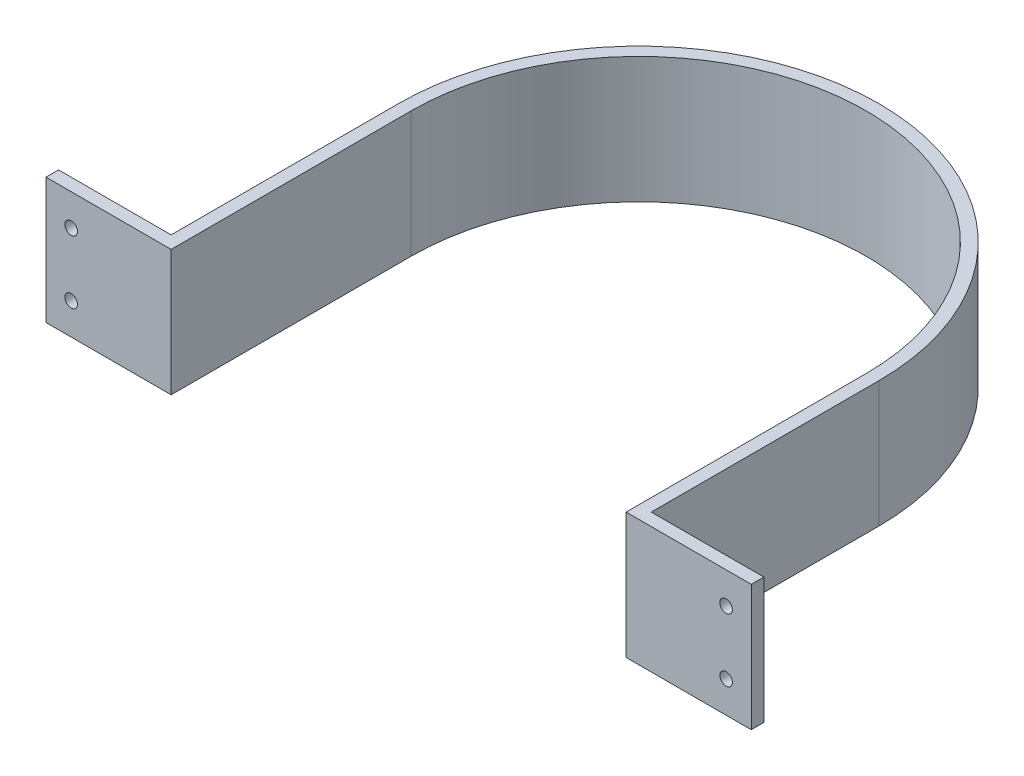
ISO-10303-21;
HEADER;
FILE_DESCRIPTION(('STEP AP214'),'2;1');
FILE_NAME('part.step','',(''),(''),'','','');
FILE_SCHEMA(('AUTOMOTIVE_DESIGN { 1 0 10303 214 1 1 1 1 }'));
ENDSEC;
DATA;
#1=APPLICATION_CONTEXT('core data for automotive mechanical design processes');
#2=APPLICATION_PROTOCOL_DEFINITION('international standard','automotive_design',2000,#1);
#3=PRODUCT_CONTEXT('',#1,'mechanical');
#4=PRODUCT('Part','Part','',(#3));
#5=PRODUCT_RELATED_PRODUCT_CATEGORY('part','',(#4));
#6=PRODUCT_DEFINITION_FORMATION('','',#4);
#7=PRODUCT_DEFINITION_CONTEXT('part definition',#1,'design');
#8=PRODUCT_DEFINITION('design','',#6,#7);
#9=PRODUCT_DEFINITION_SHAPE('','',#8);
#10=(LENGTH_UNIT() NAMED_UNIT(*) SI_UNIT(.MILLI.,.METRE.));
#11=(NAMED_UNIT(*) PLANE_ANGLE_UNIT() SI_UNIT($,.RADIAN.));
#12=(NAMED_UNIT(*) SI_UNIT($,.STERADIAN.) SOLID_ANGLE_UNIT());
#13=UNCERTAINTY_MEASURE_WITH_UNIT(LENGTH_MEASURE(1.E-05),#10,'distance_accuracy_value','');
#14=(GEOMETRIC_REPRESENTATION_CONTEXT(3) GLOBAL_UNCERTAINTY_ASSIGNED_CONTEXT((#13)) GLOBAL_UNIT_ASSIGNED_CONTEXT((#10,
#11,#12)) REPRESENTATION_CONTEXT('',''));
#15=CARTESIAN_POINT('',(0.,0.,0.));
#16=DIRECTION('',(0.,0.,1.));
#17=DIRECTION('',(1.,0.,0.));
#18=AXIS2_PLACEMENT_3D('',#15,#16,#17);
#19=CARTESIAN_POINT('',(0.,31.75,114.7));
#20=DIRECTION('',(0.,0.,1.));
#21=DIRECTION('',(1.,0.,0.));
#22=AXIS2_PLACEMENT_3D('',#19,#20,#21);
#23=PLANE('',#22);
#24=CARTESIAN_POINT('',(-165.1,-15.875,114.7));
#25=DIRECTION('',(0.,0.,1.));
#26=DIRECTION('',(1.,0.,0.));
#27=AXIS2_PLACEMENT_3D('',#24,#25,#26);
#28=CIRCLE('',#27,3.175);
#29=CARTESIAN_POINT('',(-161.925,-15.875,114.7));
#30=VERTEX_POINT('',#29);
#31=EDGE_CURVE('E304',#30,#30,#28,.F.);
#32=ORIENTED_EDGE('',*,*,#31,.F.);
#33=EDGE_LOOP('',(#32));
#34=FACE_BOUND('',#33,.T.);
#35=CARTESIAN_POINT('',(-165.1,15.875,114.7));
#36=DIRECTION('',(0.,0.,1.));
#37=DIRECTION('',(1.,0.,0.));
#38=AXIS2_PLACEMENT_3D('',#35,#36,#37);
#39=CIRCLE('',#38,3.175);
#40=CARTESIAN_POINT('',(-161.925,15.875,114.7));
#41=VERTEX_POINT('',#40);
#42=EDGE_CURVE('E174',#41,#41,#39,.F.);
#43=ORIENTED_EDGE('',*,*,#42,.F.);
#44=EDGE_LOOP('',(#43));
#45=FACE_BOUND('',#44,.T.);
#46=DIRECTION('',(-1.,0.,0.));
#47=VECTOR('',#46,1.);
#48=CARTESIAN_POINT('',(0.,-31.75,114.7));
#49=LINE('',#48,#47);
#50=CARTESIAN_POINT('',(-121.05,-31.75,114.7));
#51=VERTEX_POINT('',#50);
#52=CARTESIAN_POINT('',(-177.8,-31.75,114.7));
#53=VERTEX_POINT('',#52);
#54=EDGE_CURVE('E169',#51,#53,#49,.T.);
#55=ORIENTED_EDGE('',*,*,#54,.T.);
#56=DIRECTION('',(0.,-1.,0.));
#57=VECTOR('',#56,1.);
#58=CARTESIAN_POINT('',(-177.8,31.75,114.7));
#59=LINE('',#58,#57);
#60=CARTESIAN_POINT('',(-177.8,31.75,114.7));
#61=VERTEX_POINT('',#60);
#62=EDGE_CURVE('E11',#61,#53,#59,.T.);
#63=ORIENTED_EDGE('',*,*,#62,.F.);
#64=DIRECTION('',(-1.,0.,0.));
#65=VECTOR('',#64,1.);
#66=CARTESIAN_POINT('',(0.,31.75,114.7));
#67=LINE('',#66,#65);
#68=CARTESIAN_POINT('',(-121.05,31.75,114.7));
#69=VERTEX_POINT('',#68);
#70=EDGE_CURVE('E211',#69,#61,#67,.T.);
#71=ORIENTED_EDGE('',*,*,#70,.F.);
#72=DIRECTION('',(0.,-1.,0.));
#73=VECTOR('',#72,1.);
#74=CARTESIAN_POINT('',(-121.05,31.75,114.7));
#75=LINE('',#74,#73);
#76=EDGE_CURVE('E168',#69,#51,#75,.T.);
#77=ORIENTED_EDGE('',*,*,#76,.T.);
#78=EDGE_LOOP('',(#55,#63,#71,#77));
#79=FACE_BOUND('',#78,.T.);
#80=ADVANCED_FACE('F41',(#34,#45,#79),#23,.F.);
#81=CARTESIAN_POINT('',(-177.8,31.75,0.));
#82=DIRECTION('',(1.,0.,0.));
#83=DIRECTION('',(0.,0.,-1.));
#84=AXIS2_PLACEMENT_3D('',#81,#82,#83);
#85=PLANE('',#84);
#86=DIRECTION('',(0.,0.,1.));
#87=VECTOR('',#86,1.);
#88=CARTESIAN_POINT('',(-177.8,-31.75,0.));
#89=LINE('',#88,#87);
#90=CARTESIAN_POINT('',(-177.8,-31.75,121.05));
#91=VERTEX_POINT('',#90);
#92=EDGE_CURVE('E173',#53,#91,#89,.T.);
#93=ORIENTED_EDGE('',*,*,#92,.T.);
#94=DIRECTION('',(0.,-1.,0.));
#95=VECTOR('',#94,1.);
#96=CARTESIAN_POINT('',(-177.8,31.75,121.05));
#97=LINE('',#96,#95);
#98=CARTESIAN_POINT('',(-177.8,31.75,121.05));
#99=VERTEX_POINT('',#98);
#100=EDGE_CURVE('E50',#99,#91,#97,.T.);
#101=ORIENTED_EDGE('',*,*,#100,.F.);
#102=DIRECTION('',(0.,0.,1.));
#103=VECTOR('',#102,1.);
#104=CARTESIAN_POINT('',(-177.8,31.75,0.));
#105=LINE('',#104,#103);
#106=EDGE_CURVE('E112',#61,#99,#105,.T.);
#107=ORIENTED_EDGE('',*,*,#106,.F.);
#108=ORIENTED_EDGE('',*,*,#62,.T.);
#109=EDGE_LOOP('',(#93,#101,#107,#108));
#110=FACE_BOUND('',#109,.T.);
#111=ADVANCED_FACE('F243',(#110),#85,.F.);
#112=CARTESIAN_POINT('',(0.,31.75,121.05));
#113=DIRECTION('',(0.,0.,1.));
#114=DIRECTION('',(1.,0.,0.));
#115=AXIS2_PLACEMENT_3D('',#112,#113,#114);
#116=PLANE('',#115);
#117=CARTESIAN_POINT('',(-165.1,-15.875,121.05));
#118=DIRECTION('',(0.,0.,1.));
#119=DIRECTION('',(-1.,0.,0.));
#120=AXIS2_PLACEMENT_3D('',#117,#118,#119);
#121=CIRCLE('',#120,3.175);
#122=CARTESIAN_POINT('',(-168.275,-15.875,121.05));
#123=VERTEX_POINT('',#122);
#124=EDGE_CURVE('E320',#123,#123,#121,.T.);
#125=ORIENTED_EDGE('',*,*,#124,.F.);
#126=EDGE_LOOP('',(#125));
#127=FACE_BOUND('',#126,.T.);
#128=CARTESIAN_POINT('',(-165.1,15.875,121.05));
#129=DIRECTION('',(0.,0.,1.));
#130=DIRECTION('',(1.,0.,0.));
#131=AXIS2_PLACEMENT_3D('',#128,#129,#130);
#132=CIRCLE('',#131,3.175);
#133=CARTESIAN_POINT('',(-161.925,15.875,121.05));
#134=VERTEX_POINT('',#133);
#135=EDGE_CURVE('E309',#134,#134,#132,.T.);
#136=ORIENTED_EDGE('',*,*,#135,.F.);
#137=EDGE_LOOP('',(#136));
#138=FACE_BOUND('',#137,.T.);
#139=DIRECTION('',(-1.,0.,0.));
#140=VECTOR('',#139,1.);
#141=CARTESIAN_POINT('',(0.,-31.75,121.05));
#142=LINE('',#141,#140);
#143=CARTESIAN_POINT('',(-114.7,-31.75,121.05));
#144=VERTEX_POINT('',#143);
#145=EDGE_CURVE('E178',#144,#91,#142,.T.);
#146=ORIENTED_EDGE('',*,*,#145,.F.);
#147=DIRECTION('',(0.,-1.,0.));
#148=VECTOR('',#147,1.);
#149=CARTESIAN_POINT('',(-114.7,31.75,121.05));
#150=LINE('',#149,#148);
#151=CARTESIAN_POINT('',(-114.7,31.75,121.05));
#152=VERTEX_POINT('',#151);
#153=EDGE_CURVE('E234',#152,#144,#150,.T.);
#154=ORIENTED_EDGE('',*,*,#153,.F.);
#155=DIRECTION('',(-1.,0.,0.));
#156=VECTOR('',#155,1.);
#157=CARTESIAN_POINT('',(0.,31.75,121.05));
#158=LINE('',#157,#156);
#159=EDGE_CURVE('E242',#152,#99,#158,.T.);
#160=ORIENTED_EDGE('',*,*,#159,.T.);
#161=ORIENTED_EDGE('',*,*,#100,.T.);
#162=EDGE_LOOP('',(#146,#154,#160,#161));
#163=FACE_BOUND('',#162,.T.);
#164=ADVANCED_FACE('F240',(#127,#138,#163),#116,.T.);
#165=CARTESIAN_POINT('',(-114.7,31.75,0.));
#166=DIRECTION('',(1.,0.,0.));
#167=DIRECTION('',(0.,0.,-1.));
#168=AXIS2_PLACEMENT_3D('',#165,#166,#167);
#169=PLANE('',#168);
#170=DIRECTION('',(0.,0.,1.));
#171=VECTOR('',#170,1.);
#172=CARTESIAN_POINT('',(-114.7,-31.75,0.));
#173=LINE('',#172,#171);
#174=CARTESIAN_POINT('',(-114.7,-31.75,0.));
#175=VERTEX_POINT('',#174);
#176=EDGE_CURVE('E182',#175,#144,#173,.T.);
#177=ORIENTED_EDGE('',*,*,#176,.F.);
#178=DIRECTION('',(0.,-1.,0.));
#179=VECTOR('',#178,1.);
#180=CARTESIAN_POINT('',(-114.7,31.75,0.));
#181=LINE('',#180,#179);
#182=CARTESIAN_POINT('',(-114.7,31.75,0.));
#183=VERTEX_POINT('',#182);
#184=EDGE_CURVE('E231',#183,#175,#181,.T.);
#185=ORIENTED_EDGE('',*,*,#184,.F.);
#186=DIRECTION('',(0.,0.,1.));
#187=VECTOR('',#186,1.);
#188=CARTESIAN_POINT('',(-114.7,31.75,0.));
#189=LINE('',#188,#187);
#190=EDGE_CURVE('E255',#183,#152,#189,.T.);
#191=ORIENTED_EDGE('',*,*,#190,.T.);
#192=ORIENTED_EDGE('',*,*,#153,.T.);
#193=EDGE_LOOP('',(#177,#185,#191,#192));
#194=FACE_BOUND('',#193,.T.);
#195=ADVANCED_FACE('F252',(#194),#169,.T.);
#196=CARTESIAN_POINT('',(0.,31.75,0.));
#197=DIRECTION('',(0.,-1.,0.));
#198=DIRECTION('',(0.,0.,-1.));
#199=AXIS2_PLACEMENT_3D('',#196,#197,#198);
#200=CYLINDRICAL_SURFACE('',#199,114.7);
#201=CARTESIAN_POINT('',(0.,-31.75,0.));
#202=DIRECTION('',(0.,1.,0.));
#203=DIRECTION('',(0.,0.,1.));
#204=AXIS2_PLACEMENT_3D('',#201,#202,#203);
#205=CIRCLE('',#204,114.7);
#206=CARTESIAN_POINT('',(114.7,-31.75,0.));
#207=VERTEX_POINT('',#206);
#208=EDGE_CURVE('E186',#207,#175,#205,.T.);
#209=ORIENTED_EDGE('',*,*,#208,.F.);
#210=DIRECTION('',(0.,-1.,0.));
#211=VECTOR('',#210,1.);
#212=CARTESIAN_POINT('',(114.7,31.75,0.));
#213=LINE('',#212,#211);
#214=CARTESIAN_POINT('',(114.7,31.75,0.));
#215=VERTEX_POINT('',#214);
#216=EDGE_CURVE('E228',#215,#207,#213,.T.);
#217=ORIENTED_EDGE('',*,*,#216,.F.);
#218=CARTESIAN_POINT('',(0.,31.75,0.));
#219=DIRECTION('',(0.,1.,0.));
#220=DIRECTION('',(0.,0.,1.));
#221=AXIS2_PLACEMENT_3D('',#218,#219,#220);
#222=CIRCLE('',#221,114.7);
#223=EDGE_CURVE('E262',#215,#183,#222,.T.);
#224=ORIENTED_EDGE('',*,*,#223,.T.);
#225=ORIENTED_EDGE('',*,*,#184,.T.);
#226=EDGE_LOOP('',(#209,#217,#224,#225));
#227=FACE_BOUND('',#226,.T.);
#228=ADVANCED_FACE('F351',(#227),#200,.F.);
#229=CARTESIAN_POINT('',(114.7,31.75,0.));
#230=DIRECTION('',(1.,0.,0.));
#231=DIRECTION('',(0.,0.,-1.));
#232=AXIS2_PLACEMENT_3D('',#229,#230,#231);
#233=PLANE('',#232);
#234=DIRECTION('',(0.,0.,1.));
#235=VECTOR('',#234,1.);
#236=CARTESIAN_POINT('',(114.7,-31.75,0.));
#237=LINE('',#236,#235);
#238=CARTESIAN_POINT('',(114.7,-31.75,121.05));
#239=VERTEX_POINT('',#238);
#240=EDGE_CURVE('E190',#207,#239,#237,.T.);
#241=ORIENTED_EDGE('',*,*,#240,.T.);
#242=DIRECTION('',(0.,-1.,0.));
#243=VECTOR('',#242,1.);
#244=CARTESIAN_POINT('',(114.7,31.75,121.05));
#245=LINE('',#244,#243);
#246=CARTESIAN_POINT('',(114.7,31.75,121.05));
#247=VERTEX_POINT('',#246);
#248=EDGE_CURVE('E224',#247,#239,#245,.T.);
#249=ORIENTED_EDGE('',*,*,#248,.F.);
#250=DIRECTION('',(0.,0.,1.));
#251=VECTOR('',#250,1.);
#252=CARTESIAN_POINT('',(114.7,31.75,0.));
#253=LINE('',#252,#251);
#254=EDGE_CURVE('E269',#215,#247,#253,.T.);
#255=ORIENTED_EDGE('',*,*,#254,.F.);
#256=ORIENTED_EDGE('',*,*,#216,.T.);
#257=EDGE_LOOP('',(#241,#249,#255,#256));
#258=FACE_BOUND('',#257,.T.);
#259=ADVANCED_FACE('F344',(#258),#233,.F.);
#260=CARTESIAN_POINT('',(0.,31.75,121.05));
#261=DIRECTION('',(0.,0.,-1.));
#262=DIRECTION('',(-1.,0.,0.));
#263=AXIS2_PLACEMENT_3D('',#260,#261,#262);
#264=PLANE('',#263);
#265=CARTESIAN_POINT('',(165.1,15.8750000000001,121.05));
#266=DIRECTION('',(0.,0.,1.));
#267=DIRECTION('',(-1.,0.,0.));
#268=AXIS2_PLACEMENT_3D('',#265,#266,#267);
#269=CIRCLE('',#268,3.175);
#270=CARTESIAN_POINT('',(161.925,15.8750000000001,121.05));
#271=VERTEX_POINT('',#270);
#272=EDGE_CURVE('E319',#271,#271,#269,.T.);
#273=ORIENTED_EDGE('',*,*,#272,.F.);
#274=EDGE_LOOP('',(#273));
#275=FACE_BOUND('',#274,.T.);
#276=CARTESIAN_POINT('',(165.1,-15.8749999999999,121.05));
#277=DIRECTION('',(0.,0.,1.));
#278=DIRECTION('',(1.,0.,0.));
#279=AXIS2_PLACEMENT_3D('',#276,#277,#278);
#280=CIRCLE('',#279,3.175);
#281=CARTESIAN_POINT('',(168.275,-15.8749999999999,121.05));
#282=VERTEX_POINT('',#281);
#283=EDGE_CURVE('E328',#282,#282,#280,.T.);
#284=ORIENTED_EDGE('',*,*,#283,.F.);
#285=EDGE_LOOP('',(#284));
#286=FACE_BOUND('',#285,.T.);
#287=DIRECTION('',(1.,0.,0.));
#288=VECTOR('',#287,1.);
#289=CARTESIAN_POINT('',(0.,-31.75,121.05));
#290=LINE('',#289,#288);
#291=CARTESIAN_POINT('',(177.8,-31.75,121.05));
#292=VERTEX_POINT('',#291);
#293=EDGE_CURVE('E193',#239,#292,#290,.T.);
#294=ORIENTED_EDGE('',*,*,#293,.T.);
#295=DIRECTION('',(0.,-1.,0.));
#296=VECTOR('',#295,1.);
#297=CARTESIAN_POINT('',(177.8,31.75,121.05));
#298=LINE('',#297,#296);
#299=CARTESIAN_POINT('',(177.8,31.75,121.05));
#300=VERTEX_POINT('',#299);
#301=EDGE_CURVE('E221',#300,#292,#298,.T.);
#302=ORIENTED_EDGE('',*,*,#301,.F.);
#303=DIRECTION('',(1.,0.,0.));
#304=VECTOR('',#303,1.);
#305=CARTESIAN_POINT('',(0.,31.75,121.05));
#306=LINE('',#305,#304);
#307=EDGE_CURVE('E272',#247,#300,#306,.T.);
#308=ORIENTED_EDGE('',*,*,#307,.F.);
#309=ORIENTED_EDGE('',*,*,#248,.T.);
#310=EDGE_LOOP('',(#294,#302,#308,#309));
#311=FACE_BOUND('',#310,.T.);
#312=ADVANCED_FACE('F341',(#275,#286,#311),#264,.F.);
#313=CARTESIAN_POINT('',(177.8,31.75,0.));
#314=DIRECTION('',(1.,0.,0.));
#315=DIRECTION('',(0.,0.,-1.));
#316=AXIS2_PLACEMENT_3D('',#313,#314,#315);
#317=PLANE('',#316);
#318=DIRECTION('',(0.,0.,1.));
#319=VECTOR('',#318,1.);
#320=CARTESIAN_POINT('',(177.8,-31.75,0.));
#321=LINE('',#320,#319);
#322=CARTESIAN_POINT('',(177.8,-31.75,114.7));
#323=VERTEX_POINT('',#322);
#324=EDGE_CURVE('E197',#323,#292,#321,.T.);
#325=ORIENTED_EDGE('',*,*,#324,.F.);
#326=DIRECTION('',(0.,-1.,0.));
#327=VECTOR('',#326,1.);
#328=CARTESIAN_POINT('',(177.8,31.75,114.7));
#329=LINE('',#328,#327);
#330=CARTESIAN_POINT('',(177.8,31.75,114.7));
#331=VERTEX_POINT('',#330);
#332=EDGE_CURVE('E218',#331,#323,#329,.T.);
#333=ORIENTED_EDGE('',*,*,#332,.F.);
#334=DIRECTION('',(0.,0.,1.));
#335=VECTOR('',#334,1.);
#336=CARTESIAN_POINT('',(177.8,31.75,0.));
#337=LINE('',#336,#335);
#338=EDGE_CURVE('E162',#331,#300,#337,.T.);
#339=ORIENTED_EDGE('',*,*,#338,.T.);
#340=ORIENTED_EDGE('',*,*,#301,.T.);
#341=EDGE_LOOP('',(#325,#333,#339,#340));
#342=FACE_BOUND('',#341,.T.);
#343=ADVANCED_FACE('F278',(#342),#317,.T.);
#344=CARTESIAN_POINT('',(0.,31.75,114.7));
#345=DIRECTION('',(0.,0.,-1.));
#346=DIRECTION('',(-1.,0.,0.));
#347=AXIS2_PLACEMENT_3D('',#344,#345,#346);
#348=PLANE('',#347);
#349=CARTESIAN_POINT('',(165.1,15.8750000000001,114.7));
#350=DIRECTION('',(0.,0.,1.));
#351=DIRECTION('',(1.,0.,0.));
#352=AXIS2_PLACEMENT_3D('',#349,#350,#351);
#353=CIRCLE('',#352,3.175);
#354=CARTESIAN_POINT('',(168.275,15.8750000000001,114.7));
#355=VERTEX_POINT('',#354);
#356=EDGE_CURVE('E324',#355,#355,#353,.F.);
#357=ORIENTED_EDGE('',*,*,#356,.F.);
#358=EDGE_LOOP('',(#357));
#359=FACE_BOUND('',#358,.T.);
#360=CARTESIAN_POINT('',(165.1,-15.8749999999999,114.7));
#361=DIRECTION('',(0.,0.,1.));
#362=DIRECTION('',(1.,0.,0.));
#363=AXIS2_PLACEMENT_3D('',#360,#361,#362);
#364=CIRCLE('',#363,3.175);
#365=CARTESIAN_POINT('',(168.275,-15.8749999999999,114.7));
#366=VERTEX_POINT('',#365);
#367=EDGE_CURVE('E313',#366,#366,#364,.F.);
#368=ORIENTED_EDGE('',*,*,#367,.F.);
#369=EDGE_LOOP('',(#368));
#370=FACE_BOUND('',#369,.T.);
#371=DIRECTION('',(1.,0.,0.));
#372=VECTOR('',#371,1.);
#373=CARTESIAN_POINT('',(0.,-31.75,114.7));
#374=LINE('',#373,#372);
#375=CARTESIAN_POINT('',(121.05,-31.75,114.7));
#376=VERTEX_POINT('',#375);
#377=EDGE_CURVE('E201',#376,#323,#374,.T.);
#378=ORIENTED_EDGE('',*,*,#377,.F.);
#379=DIRECTION('',(0.,-1.,0.));
#380=VECTOR('',#379,1.);
#381=CARTESIAN_POINT('',(121.05,31.75,114.7));
#382=LINE('',#381,#380);
#383=CARTESIAN_POINT('',(121.05,31.75,114.7));
#384=VERTEX_POINT('',#383);
#385=EDGE_CURVE('E147',#384,#376,#382,.T.);
#386=ORIENTED_EDGE('',*,*,#385,.F.);
#387=DIRECTION('',(1.,0.,0.));
#388=VECTOR('',#387,1.);
#389=CARTESIAN_POINT('',(0.,31.75,114.7));
#390=LINE('',#389,#388);
#391=EDGE_CURVE('E158',#384,#331,#390,.T.);
#392=ORIENTED_EDGE('',*,*,#391,.T.);
#393=ORIENTED_EDGE('',*,*,#332,.T.);
#394=EDGE_LOOP('',(#378,#386,#392,#393));
#395=FACE_BOUND('',#394,.T.);
#396=ADVANCED_FACE('F283',(#359,#370,#395),#348,.T.);
#397=CARTESIAN_POINT('',(121.05,31.75,0.));
#398=DIRECTION('',(1.,0.,0.));
#399=DIRECTION('',(0.,0.,-1.));
#400=AXIS2_PLACEMENT_3D('',#397,#398,#399);
#401=PLANE('',#400);
#402=DIRECTION('',(0.,0.,1.));
#403=VECTOR('',#402,1.);
#404=CARTESIAN_POINT('',(121.05,-31.75,0.));
#405=LINE('',#404,#403);
#406=CARTESIAN_POINT('',(121.05,-31.75,0.));
#407=VERTEX_POINT('',#406);
#408=EDGE_CURVE('E145',#407,#376,#405,.T.);
#409=ORIENTED_EDGE('',*,*,#408,.F.);
#410=DIRECTION('',(0.,-1.,0.));
#411=VECTOR('',#410,1.);
#412=CARTESIAN_POINT('',(121.05,31.75,0.));
#413=LINE('',#412,#411);
#414=CARTESIAN_POINT('',(121.05,31.75,0.));
#415=VERTEX_POINT('',#414);
#416=EDGE_CURVE('E139',#415,#407,#413,.T.);
#417=ORIENTED_EDGE('',*,*,#416,.F.);
#418=DIRECTION('',(0.,0.,1.));
#419=VECTOR('',#418,1.);
#420=CARTESIAN_POINT('',(121.05,31.75,0.));
#421=LINE('',#420,#419);
#422=EDGE_CURVE('E143',#415,#384,#421,.T.);
#423=ORIENTED_EDGE('',*,*,#422,.T.);
#424=ORIENTED_EDGE('',*,*,#385,.T.);
#425=EDGE_LOOP('',(#409,#417,#423,#424));
#426=FACE_BOUND('',#425,.T.);
#427=ADVANCED_FACE('F141',(#426),#401,.T.);
#428=CARTESIAN_POINT('',(0.,31.75,0.));
#429=DIRECTION('',(0.,-1.,0.));
#430=DIRECTION('',(0.,0.,-1.));
#431=AXIS2_PLACEMENT_3D('',#428,#429,#430);
#432=CYLINDRICAL_SURFACE('',#431,121.05);
#433=CARTESIAN_POINT('',(0.,-31.75,0.));
#434=DIRECTION('',(0.,1.,0.));
#435=DIRECTION('',(0.,0.,1.));
#436=AXIS2_PLACEMENT_3D('',#433,#434,#435);
#437=CIRCLE('',#436,121.05);
#438=CARTESIAN_POINT('',(-121.05,-31.75,0.));
#439=VERTEX_POINT('',#438);
#440=EDGE_CURVE('E98',#407,#439,#437,.T.);
#441=ORIENTED_EDGE('',*,*,#440,.T.);
#442=DIRECTION('',(0.,-1.,0.));
#443=VECTOR('',#442,1.);
#444=CARTESIAN_POINT('',(-121.05,31.75,0.));
#445=LINE('',#444,#443);
#446=CARTESIAN_POINT('',(-121.05,31.75,0.));
#447=VERTEX_POINT('',#446);
#448=EDGE_CURVE('E148',#447,#439,#445,.T.);
#449=ORIENTED_EDGE('',*,*,#448,.F.);
#450=CARTESIAN_POINT('',(0.,31.75,0.));
#451=DIRECTION('',(0.,1.,0.));
#452=DIRECTION('',(0.,0.,1.));
#453=AXIS2_PLACEMENT_3D('',#450,#451,#452);
#454=CIRCLE('',#453,121.05);
#455=EDGE_CURVE('E150',#415,#447,#454,.T.);
#456=ORIENTED_EDGE('',*,*,#455,.F.);
#457=ORIENTED_EDGE('',*,*,#416,.T.);
#458=EDGE_LOOP('',(#441,#449,#456,#457));
#459=FACE_BOUND('',#458,.T.);
#460=ADVANCED_FACE('F151',(#459),#432,.T.);
#461=CARTESIAN_POINT('',(-121.05,31.75,0.));
#462=DIRECTION('',(1.,0.,0.));
#463=DIRECTION('',(0.,0.,-1.));
#464=AXIS2_PLACEMENT_3D('',#461,#462,#463);
#465=PLANE('',#464);
#466=DIRECTION('',(0.,0.,1.));
#467=VECTOR('',#466,1.);
#468=CARTESIAN_POINT('',(-121.05,-31.75,0.));
#469=LINE('',#468,#467);
#470=EDGE_CURVE('E104',#439,#51,#469,.T.);
#471=ORIENTED_EDGE('',*,*,#470,.T.);
#472=ORIENTED_EDGE('',*,*,#76,.F.);
#473=DIRECTION('',(0.,0.,1.));
#474=VECTOR('',#473,1.);
#475=CARTESIAN_POINT('',(-121.05,31.75,0.));
#476=LINE('',#475,#474);
#477=EDGE_CURVE('E58',#447,#69,#476,.T.);
#478=ORIENTED_EDGE('',*,*,#477,.F.);
#479=ORIENTED_EDGE('',*,*,#448,.T.);
#480=EDGE_LOOP('',(#471,#472,#478,#479));
#481=FACE_BOUND('',#480,.T.);
#482=ADVANCED_FACE('F286',(#481),#465,.F.);
#483=CARTESIAN_POINT('',(0.,31.75,0.));
#484=DIRECTION('',(0.,1.,0.));
#485=DIRECTION('',(0.,0.,1.));
#486=AXIS2_PLACEMENT_3D('',#483,#484,#485);
#487=PLANE('',#486);
#488=ORIENTED_EDGE('',*,*,#70,.T.);
#489=ORIENTED_EDGE('',*,*,#106,.T.);
#490=ORIENTED_EDGE('',*,*,#159,.F.);
#491=ORIENTED_EDGE('',*,*,#190,.F.);
#492=ORIENTED_EDGE('',*,*,#223,.F.);
#493=ORIENTED_EDGE('',*,*,#254,.T.);
#494=ORIENTED_EDGE('',*,*,#307,.T.);
#495=ORIENTED_EDGE('',*,*,#338,.F.);
#496=ORIENTED_EDGE('',*,*,#391,.F.);
#497=ORIENTED_EDGE('',*,*,#422,.F.);
#498=ORIENTED_EDGE('',*,*,#455,.T.);
#499=ORIENTED_EDGE('',*,*,#477,.T.);
#500=EDGE_LOOP('',(#488,#489,#490,#491,#492,#493,#494,#495,#496,#497,#498,#499));
#501=FACE_BOUND('',#500,.T.);
#502=ADVANCED_FACE('F155',(#501),#487,.T.);
#503=CARTESIAN_POINT('',(0.,-31.75,0.));
#504=DIRECTION('',(0.,1.,0.));
#505=DIRECTION('',(0.,0.,1.));
#506=AXIS2_PLACEMENT_3D('',#503,#504,#505);
#507=PLANE('',#506);
#508=ORIENTED_EDGE('',*,*,#54,.F.);
#509=ORIENTED_EDGE('',*,*,#470,.F.);
#510=ORIENTED_EDGE('',*,*,#440,.F.);
#511=ORIENTED_EDGE('',*,*,#408,.T.);
#512=ORIENTED_EDGE('',*,*,#377,.T.);
#513=ORIENTED_EDGE('',*,*,#324,.T.);
#514=ORIENTED_EDGE('',*,*,#293,.F.);
#515=ORIENTED_EDGE('',*,*,#240,.F.);
#516=ORIENTED_EDGE('',*,*,#208,.T.);
#517=ORIENTED_EDGE('',*,*,#176,.T.);
#518=ORIENTED_EDGE('',*,*,#145,.T.);
#519=ORIENTED_EDGE('',*,*,#92,.F.);
#520=EDGE_LOOP('',(#508,#509,#510,#511,#512,#513,#514,#515,#516,#517,#518,#519));
#521=FACE_BOUND('',#520,.T.);
#522=ADVANCED_FACE('F247',(#521),#507,.F.);
#523=CARTESIAN_POINT('',(165.1,-15.8749999999999,105.719743878931));
#524=DIRECTION('',(0.,0.,1.));
#525=DIRECTION('',(1.,0.,0.));
#526=AXIS2_PLACEMENT_3D('',#523,#524,#525);
#527=CYLINDRICAL_SURFACE('',#526,3.175);
#528=ORIENTED_EDGE('',*,*,#367,.T.);
#529=EDGE_LOOP('',(#528));
#530=FACE_BOUND('',#529,.T.);
#531=ORIENTED_EDGE('',*,*,#283,.T.);
#532=EDGE_LOOP('',(#531));
#533=FACE_BOUND('',#532,.T.);
#534=ADVANCED_FACE('F339',(#530,#533),#527,.F.);
#535=CARTESIAN_POINT('',(165.1,15.8750000000001,105.719743878931));
#536=DIRECTION('',(0.,0.,1.));
#537=DIRECTION('',(1.,0.,0.));
#538=AXIS2_PLACEMENT_3D('',#535,#536,#537);
#539=CYLINDRICAL_SURFACE('',#538,3.175);
#540=ORIENTED_EDGE('',*,*,#356,.T.);
#541=EDGE_LOOP('',(#540));
#542=FACE_BOUND('',#541,.T.);
#543=ORIENTED_EDGE('',*,*,#272,.T.);
#544=EDGE_LOOP('',(#543));
#545=FACE_BOUND('',#544,.T.);
#546=ADVANCED_FACE('F374',(#542,#545),#539,.F.);
#547=CARTESIAN_POINT('',(-165.1,15.875,105.719743878931));
#548=DIRECTION('',(0.,0.,1.));
#549=DIRECTION('',(1.,0.,0.));
#550=AXIS2_PLACEMENT_3D('',#547,#548,#549);
#551=CYLINDRICAL_SURFACE('',#550,3.175);
#552=ORIENTED_EDGE('',*,*,#42,.T.);
#553=EDGE_LOOP('',(#552));
#554=FACE_BOUND('',#553,.T.);
#555=ORIENTED_EDGE('',*,*,#135,.T.);
#556=EDGE_LOOP('',(#555));
#557=FACE_BOUND('',#556,.T.);
#558=ADVANCED_FACE('F371',(#554,#557),#551,.F.);
#559=CARTESIAN_POINT('',(-165.1,-15.875,105.719743878931));
#560=DIRECTION('',(0.,0.,1.));
#561=DIRECTION('',(1.,0.,0.));
#562=AXIS2_PLACEMENT_3D('',#559,#560,#561);
#563=CYLINDRICAL_SURFACE('',#562,3.175);
#564=ORIENTED_EDGE('',*,*,#31,.T.);
#565=EDGE_LOOP('',(#564));
#566=FACE_BOUND('',#565,.T.);
#567=ORIENTED_EDGE('',*,*,#124,.T.);
#568=EDGE_LOOP('',(#567));
#569=FACE_BOUND('',#568,.T.);
#570=ADVANCED_FACE('F373',(#566,#569),#563,.F.);
#571=CLOSED_SHELL('',(#80,#111,#164,#195,#228,#259,#312,#343,#396,#427,#460,#482,#502,#522,#534,
#546,#558,#570));
#572=MANIFOLD_SOLID_BREP('B2',#571);
#573=ADVANCED_BREP_SHAPE_REPRESENTATION('',(#18,#572),#14);
#574=SHAPE_DEFINITION_REPRESENTATION(#9,#573);
ENDSEC;
END-ISO-10303-21;
